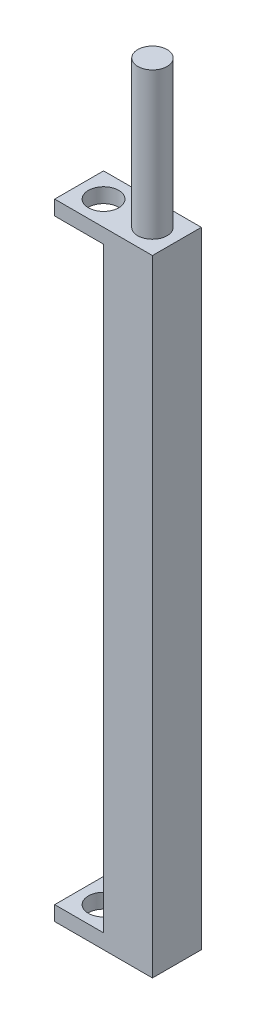
ISO-10303-21;
HEADER;
FILE_DESCRIPTION(('STEP AP214'),'2;1');
FILE_NAME('part.step','',(''),(''),'','','');
FILE_SCHEMA(('AUTOMOTIVE_DESIGN { 1 0 10303 214 1 1 1 1 }'));
ENDSEC;
DATA;
#1=APPLICATION_CONTEXT('core data for automotive mechanical design processes');
#2=APPLICATION_PROTOCOL_DEFINITION('international standard','automotive_design',2000,#1);
#3=PRODUCT_CONTEXT('',#1,'mechanical');
#4=PRODUCT('Part','Part','',(#3));
#5=PRODUCT_RELATED_PRODUCT_CATEGORY('part','',(#4));
#6=PRODUCT_DEFINITION_FORMATION('','',#4);
#7=PRODUCT_DEFINITION_CONTEXT('part definition',#1,'design');
#8=PRODUCT_DEFINITION('design','',#6,#7);
#9=PRODUCT_DEFINITION_SHAPE('','',#8);
#10=(LENGTH_UNIT() NAMED_UNIT(*) SI_UNIT(.MILLI.,.METRE.));
#11=(NAMED_UNIT(*) PLANE_ANGLE_UNIT() SI_UNIT($,.RADIAN.));
#12=(NAMED_UNIT(*) SI_UNIT($,.STERADIAN.) SOLID_ANGLE_UNIT());
#13=UNCERTAINTY_MEASURE_WITH_UNIT(LENGTH_MEASURE(1.E-05),#10,'distance_accuracy_value','');
#14=(GEOMETRIC_REPRESENTATION_CONTEXT(3) GLOBAL_UNCERTAINTY_ASSIGNED_CONTEXT((#13)) GLOBAL_UNIT_ASSIGNED_CONTEXT((#10,
#11,#12)) REPRESENTATION_CONTEXT('',''));
#15=CARTESIAN_POINT('',(0.,0.,0.));
#16=DIRECTION('',(0.,0.,1.));
#17=DIRECTION('',(1.,0.,0.));
#18=AXIS2_PLACEMENT_3D('',#15,#16,#17);
#19=CARTESIAN_POINT('',(0.,0.,0.));
#20=DIRECTION('',(0.,1.,0.));
#21=DIRECTION('',(0.,0.,1.));
#22=AXIS2_PLACEMENT_3D('',#19,#20,#21);
#23=PLANE('',#22);
#24=CARTESIAN_POINT('',(-2.5,0.,0.));
#25=DIRECTION('',(0.,-1.,0.));
#26=DIRECTION('',(0.,0.,-1.));
#27=AXIS2_PLACEMENT_3D('',#24,#25,#26);
#28=CIRCLE('',#27,1.55);
#29=CARTESIAN_POINT('',(-2.5,0.,-1.55));
#30=VERTEX_POINT('',#29);
#31=EDGE_CURVE('E155',#30,#30,#28,.T.);
#32=ORIENTED_EDGE('',*,*,#31,.F.);
#33=EDGE_LOOP('',(#32));
#34=FACE_BOUND('',#33,.T.);
#35=DIRECTION('',(0.,0.,-1.));
#36=VECTOR('',#35,1.);
#37=CARTESIAN_POINT('',(0.,0.,2.5));
#38=LINE('',#37,#36);
#39=CARTESIAN_POINT('',(0.,0.,2.5));
#40=VERTEX_POINT('',#39);
#41=CARTESIAN_POINT('',(0.,0.,-2.5));
#42=VERTEX_POINT('',#41);
#43=EDGE_CURVE('E49',#40,#42,#38,.T.);
#44=ORIENTED_EDGE('',*,*,#43,.F.);
#45=DIRECTION('',(-1.,0.,0.));
#46=VECTOR('',#45,1.);
#47=CARTESIAN_POINT('',(5.,0.,2.5));
#48=LINE('',#47,#46);
#49=CARTESIAN_POINT('',(-5.,0.,2.5));
#50=VERTEX_POINT('',#49);
#51=EDGE_CURVE('E71',#40,#50,#48,.T.);
#52=ORIENTED_EDGE('',*,*,#51,.T.);
#53=DIRECTION('',(0.,0.,-1.));
#54=VECTOR('',#53,1.);
#55=CARTESIAN_POINT('',(-5.,0.,2.5));
#56=LINE('',#55,#54);
#57=CARTESIAN_POINT('',(-5.,0.,-2.5));
#58=VERTEX_POINT('',#57);
#59=EDGE_CURVE('E169',#50,#58,#56,.T.);
#60=ORIENTED_EDGE('',*,*,#59,.T.);
#61=DIRECTION('',(-1.,0.,0.));
#62=VECTOR('',#61,1.);
#63=CARTESIAN_POINT('',(5.,0.,-2.5));
#64=LINE('',#63,#62);
#65=EDGE_CURVE('E159',#42,#58,#64,.T.);
#66=ORIENTED_EDGE('',*,*,#65,.F.);
#67=EDGE_LOOP('',(#44,#52,#60,#66));
#68=FACE_BOUND('',#67,.T.);
#69=ADVANCED_FACE('F34',(#34,#68),#23,.F.);
#70=CARTESIAN_POINT('',(5.,1.5,2.5));
#71=DIRECTION('',(-1.,0.,0.));
#72=DIRECTION('',(0.,0.,1.));
#73=AXIS2_PLACEMENT_3D('',#70,#71,#72);
#74=PLANE('',#73);
#75=DIRECTION('',(0.,-1.,0.));
#76=VECTOR('',#75,1.);
#77=CARTESIAN_POINT('',(5.,1.5,2.5));
#78=LINE('',#77,#76);
#79=CARTESIAN_POINT('',(5.,1.5,2.5));
#80=VERTEX_POINT('',#79);
#81=CARTESIAN_POINT('',(5.,-62.5,2.5));
#82=VERTEX_POINT('',#81);
#83=EDGE_CURVE('E58',#80,#82,#78,.T.);
#84=ORIENTED_EDGE('',*,*,#83,.T.);
#85=DIRECTION('',(0.,0.,1.));
#86=VECTOR('',#85,1.);
#87=CARTESIAN_POINT('',(5.,-62.5,2.5));
#88=LINE('',#87,#86);
#89=CARTESIAN_POINT('',(5.,-62.5,-2.5));
#90=VERTEX_POINT('',#89);
#91=EDGE_CURVE('E107',#90,#82,#88,.T.);
#92=ORIENTED_EDGE('',*,*,#91,.F.);
#93=DIRECTION('',(0.,-1.,0.));
#94=VECTOR('',#93,1.);
#95=CARTESIAN_POINT('',(5.,1.5,-2.5));
#96=LINE('',#95,#94);
#97=CARTESIAN_POINT('',(5.,1.5,-2.5));
#98=VERTEX_POINT('',#97);
#99=EDGE_CURVE('E11',#98,#90,#96,.T.);
#100=ORIENTED_EDGE('',*,*,#99,.F.);
#101=DIRECTION('',(0.,0.,-1.));
#102=VECTOR('',#101,1.);
#103=CARTESIAN_POINT('',(5.,1.5,2.5));
#104=LINE('',#103,#102);
#105=EDGE_CURVE('E108',#80,#98,#104,.T.);
#106=ORIENTED_EDGE('',*,*,#105,.F.);
#107=EDGE_LOOP('',(#84,#92,#100,#106));
#108=FACE_BOUND('',#107,.T.);
#109=ADVANCED_FACE('F36',(#108),#74,.F.);
#110=CARTESIAN_POINT('',(5.,1.5,-2.5));
#111=DIRECTION('',(0.,0.,1.));
#112=DIRECTION('',(1.,0.,0.));
#113=AXIS2_PLACEMENT_3D('',#110,#111,#112);
#114=PLANE('',#113);
#115=ORIENTED_EDGE('',*,*,#99,.T.);
#116=DIRECTION('',(1.,0.,0.));
#117=VECTOR('',#116,1.);
#118=CARTESIAN_POINT('',(5.,-62.5,-2.5));
#119=LINE('',#118,#117);
#120=CARTESIAN_POINT('',(-5.,-62.5,-2.5));
#121=VERTEX_POINT('',#120);
#122=EDGE_CURVE('E125',#121,#90,#119,.T.);
#123=ORIENTED_EDGE('',*,*,#122,.F.);
#124=DIRECTION('',(0.,1.,0.));
#125=VECTOR('',#124,1.);
#126=CARTESIAN_POINT('',(-5.,-62.5,-2.5));
#127=LINE('',#126,#125);
#128=CARTESIAN_POINT('',(-5.,-61.,-2.5));
#129=VERTEX_POINT('',#128);
#130=EDGE_CURVE('E137',#121,#129,#127,.T.);
#131=ORIENTED_EDGE('',*,*,#130,.T.);
#132=DIRECTION('',(1.,0.,0.));
#133=VECTOR('',#132,1.);
#134=CARTESIAN_POINT('',(5.,-61.,-2.5));
#135=LINE('',#134,#133);
#136=CARTESIAN_POINT('',(0.,-61.,-2.5));
#137=VERTEX_POINT('',#136);
#138=EDGE_CURVE('E126',#129,#137,#135,.T.);
#139=ORIENTED_EDGE('',*,*,#138,.T.);
#140=DIRECTION('',(0.,1.,0.));
#141=VECTOR('',#140,1.);
#142=CARTESIAN_POINT('',(0.,-61.,-2.5));
#143=LINE('',#142,#141);
#144=EDGE_CURVE('E148',#137,#42,#143,.T.);
#145=ORIENTED_EDGE('',*,*,#144,.T.);
#146=ORIENTED_EDGE('',*,*,#65,.T.);
#147=DIRECTION('',(0.,-1.,0.));
#148=VECTOR('',#147,1.);
#149=CARTESIAN_POINT('',(-5.,1.5,-2.5));
#150=LINE('',#149,#148);
#151=CARTESIAN_POINT('',(-5.,1.5,-2.5));
#152=VERTEX_POINT('',#151);
#153=EDGE_CURVE('E42',#152,#58,#150,.T.);
#154=ORIENTED_EDGE('',*,*,#153,.F.);
#155=DIRECTION('',(-1.,0.,0.));
#156=VECTOR('',#155,1.);
#157=CARTESIAN_POINT('',(5.,1.5,-2.5));
#158=LINE('',#157,#156);
#159=EDGE_CURVE('E78',#98,#152,#158,.T.);
#160=ORIENTED_EDGE('',*,*,#159,.F.);
#161=EDGE_LOOP('',(#115,#123,#131,#139,#145,#146,#154,#160));
#162=FACE_BOUND('',#161,.T.);
#163=ADVANCED_FACE('F180',(#162),#114,.F.);
#164=CARTESIAN_POINT('',(-5.,1.5,2.5));
#165=DIRECTION('',(-1.,0.,0.));
#166=DIRECTION('',(0.,0.,1.));
#167=AXIS2_PLACEMENT_3D('',#164,#165,#166);
#168=PLANE('',#167);
#169=ORIENTED_EDGE('',*,*,#59,.F.);
#170=DIRECTION('',(0.,-1.,0.));
#171=VECTOR('',#170,1.);
#172=CARTESIAN_POINT('',(-5.,1.5,2.5));
#173=LINE('',#172,#171);
#174=CARTESIAN_POINT('',(-5.,1.5,2.5));
#175=VERTEX_POINT('',#174);
#176=EDGE_CURVE('E110',#175,#50,#173,.T.);
#177=ORIENTED_EDGE('',*,*,#176,.F.);
#178=DIRECTION('',(0.,0.,-1.));
#179=VECTOR('',#178,1.);
#180=CARTESIAN_POINT('',(-5.,1.5,2.5));
#181=LINE('',#180,#179);
#182=EDGE_CURVE('E164',#175,#152,#181,.T.);
#183=ORIENTED_EDGE('',*,*,#182,.T.);
#184=ORIENTED_EDGE('',*,*,#153,.T.);
#185=EDGE_LOOP('',(#169,#177,#183,#184));
#186=FACE_BOUND('',#185,.T.);
#187=ADVANCED_FACE('F175',(#186),#168,.T.);
#188=CARTESIAN_POINT('',(5.,1.5,2.5));
#189=DIRECTION('',(0.,0.,1.));
#190=DIRECTION('',(1.,0.,0.));
#191=AXIS2_PLACEMENT_3D('',#188,#189,#190);
#192=PLANE('',#191);
#193=ORIENTED_EDGE('',*,*,#51,.F.);
#194=DIRECTION('',(0.,1.,0.));
#195=VECTOR('',#194,1.);
#196=CARTESIAN_POINT('',(0.,-61.,2.5));
#197=LINE('',#196,#195);
#198=CARTESIAN_POINT('',(0.,-61.,2.5));
#199=VERTEX_POINT('',#198);
#200=EDGE_CURVE('E152',#199,#40,#197,.T.);
#201=ORIENTED_EDGE('',*,*,#200,.F.);
#202=DIRECTION('',(-1.,0.,0.));
#203=VECTOR('',#202,1.);
#204=CARTESIAN_POINT('',(5.,-61.,2.5));
#205=LINE('',#204,#203);
#206=CARTESIAN_POINT('',(-5.,-61.,2.5));
#207=VERTEX_POINT('',#206);
#208=EDGE_CURVE('E138',#199,#207,#205,.T.);
#209=ORIENTED_EDGE('',*,*,#208,.T.);
#210=DIRECTION('',(0.,1.,0.));
#211=VECTOR('',#210,1.);
#212=CARTESIAN_POINT('',(-5.,-62.5,2.5));
#213=LINE('',#212,#211);
#214=CARTESIAN_POINT('',(-5.,-62.5,2.5));
#215=VERTEX_POINT('',#214);
#216=EDGE_CURVE('E117',#215,#207,#213,.T.);
#217=ORIENTED_EDGE('',*,*,#216,.F.);
#218=DIRECTION('',(-1.,0.,0.));
#219=VECTOR('',#218,1.);
#220=CARTESIAN_POINT('',(5.,-62.5,2.5));
#221=LINE('',#220,#219);
#222=EDGE_CURVE('E114',#82,#215,#221,.T.);
#223=ORIENTED_EDGE('',*,*,#222,.F.);
#224=ORIENTED_EDGE('',*,*,#83,.F.);
#225=DIRECTION('',(-1.,0.,0.));
#226=VECTOR('',#225,1.);
#227=CARTESIAN_POINT('',(5.,1.5,2.5));
#228=LINE('',#227,#226);
#229=EDGE_CURVE('E111',#80,#175,#228,.T.);
#230=ORIENTED_EDGE('',*,*,#229,.T.);
#231=ORIENTED_EDGE('',*,*,#176,.T.);
#232=EDGE_LOOP('',(#193,#201,#209,#217,#223,#224,#230,#231));
#233=FACE_BOUND('',#232,.T.);
#234=ADVANCED_FACE('F115',(#233),#192,.T.);
#235=CARTESIAN_POINT('',(0.,1.5,0.));
#236=DIRECTION('',(0.,1.,0.));
#237=DIRECTION('',(0.,0.,1.));
#238=AXIS2_PLACEMENT_3D('',#235,#236,#237);
#239=PLANE('',#238);
#240=CARTESIAN_POINT('',(2.5,1.5,0.));
#241=DIRECTION('',(0.,1.,0.));
#242=DIRECTION('',(0.,0.,1.));
#243=AXIS2_PLACEMENT_3D('',#240,#241,#242);
#244=CIRCLE('',#243,1.5);
#245=CARTESIAN_POINT('',(2.5,1.5,1.5));
#246=VERTEX_POINT('',#245);
#247=EDGE_CURVE('E324',#246,#246,#244,.T.);
#248=ORIENTED_EDGE('',*,*,#247,.F.);
#249=EDGE_LOOP('',(#248));
#250=FACE_BOUND('',#249,.T.);
#251=CARTESIAN_POINT('',(-2.5,1.5,0.));
#252=DIRECTION('',(0.,-1.,0.));
#253=DIRECTION('',(0.,0.,-1.));
#254=AXIS2_PLACEMENT_3D('',#251,#252,#253);
#255=CIRCLE('',#254,1.55);
#256=CARTESIAN_POINT('',(-2.5,1.5,-1.55));
#257=VERTEX_POINT('',#256);
#258=EDGE_CURVE('E156',#257,#257,#255,.T.);
#259=ORIENTED_EDGE('',*,*,#258,.T.);
#260=EDGE_LOOP('',(#259));
#261=FACE_BOUND('',#260,.T.);
#262=ORIENTED_EDGE('',*,*,#105,.T.);
#263=ORIENTED_EDGE('',*,*,#159,.T.);
#264=ORIENTED_EDGE('',*,*,#182,.F.);
#265=ORIENTED_EDGE('',*,*,#229,.F.);
#266=EDGE_LOOP('',(#262,#263,#264,#265));
#267=FACE_BOUND('',#266,.T.);
#268=ADVANCED_FACE('F188',(#250,#261,#267),#239,.T.);
#269=CARTESIAN_POINT('',(-2.5,1.5,0.));
#270=DIRECTION('',(0.,-1.,0.));
#271=DIRECTION('',(0.,0.,-1.));
#272=AXIS2_PLACEMENT_3D('',#269,#270,#271);
#273=CYLINDRICAL_SURFACE('',#272,1.55);
#274=ORIENTED_EDGE('',*,*,#258,.F.);
#275=EDGE_LOOP('',(#274));
#276=FACE_BOUND('',#275,.T.);
#277=ORIENTED_EDGE('',*,*,#31,.T.);
#278=EDGE_LOOP('',(#277));
#279=FACE_BOUND('',#278,.T.);
#280=ADVANCED_FACE('F190',(#276,#279),#273,.F.);
#281=CARTESIAN_POINT('',(0.,-61.,2.5));
#282=DIRECTION('',(1.,0.,0.));
#283=DIRECTION('',(0.,0.,-1.));
#284=AXIS2_PLACEMENT_3D('',#281,#282,#283);
#285=PLANE('',#284);
#286=ORIENTED_EDGE('',*,*,#43,.T.);
#287=ORIENTED_EDGE('',*,*,#144,.F.);
#288=DIRECTION('',(0.,0.,-1.));
#289=VECTOR('',#288,1.);
#290=CARTESIAN_POINT('',(0.,-61.,2.5));
#291=LINE('',#290,#289);
#292=EDGE_CURVE('E145',#199,#137,#291,.T.);
#293=ORIENTED_EDGE('',*,*,#292,.F.);
#294=ORIENTED_EDGE('',*,*,#200,.T.);
#295=EDGE_LOOP('',(#286,#287,#293,#294));
#296=FACE_BOUND('',#295,.T.);
#297=ADVANCED_FACE('F178',(#296),#285,.F.);
#298=CARTESIAN_POINT('',(-5.,-62.5,2.5));
#299=DIRECTION('',(1.,0.,0.));
#300=DIRECTION('',(0.,0.,-1.));
#301=AXIS2_PLACEMENT_3D('',#298,#299,#300);
#302=PLANE('',#301);
#303=DIRECTION('',(0.,0.,-1.));
#304=VECTOR('',#303,1.);
#305=CARTESIAN_POINT('',(-5.,-61.,2.5));
#306=LINE('',#305,#304);
#307=EDGE_CURVE('E129',#207,#129,#306,.T.);
#308=ORIENTED_EDGE('',*,*,#307,.T.);
#309=ORIENTED_EDGE('',*,*,#130,.F.);
#310=DIRECTION('',(0.,0.,-1.));
#311=VECTOR('',#310,1.);
#312=CARTESIAN_POINT('',(-5.,-62.5,2.5));
#313=LINE('',#312,#311);
#314=EDGE_CURVE('E120',#215,#121,#313,.T.);
#315=ORIENTED_EDGE('',*,*,#314,.F.);
#316=ORIENTED_EDGE('',*,*,#216,.T.);
#317=EDGE_LOOP('',(#308,#309,#315,#316));
#318=FACE_BOUND('',#317,.T.);
#319=ADVANCED_FACE('F236',(#318),#302,.F.);
#320=CARTESIAN_POINT('',(0.,-62.5,0.));
#321=DIRECTION('',(0.,1.,0.));
#322=DIRECTION('',(0.,0.,1.));
#323=AXIS2_PLACEMENT_3D('',#320,#321,#322);
#324=PLANE('',#323);
#325=CARTESIAN_POINT('',(2.5,-62.5,0.));
#326=DIRECTION('',(0.,-1.,0.));
#327=DIRECTION('',(0.,0.,-1.));
#328=AXIS2_PLACEMENT_3D('',#325,#326,#327);
#329=CIRCLE('',#328,1.55);
#330=CARTESIAN_POINT('',(2.5,-62.5,-1.55));
#331=VERTEX_POINT('',#330);
#332=EDGE_CURVE('E325',#331,#331,#329,.T.);
#333=ORIENTED_EDGE('',*,*,#332,.F.);
#334=EDGE_LOOP('',(#333));
#335=FACE_BOUND('',#334,.T.);
#336=CARTESIAN_POINT('',(-2.5,-62.5,0.));
#337=DIRECTION('',(0.,-1.,0.));
#338=DIRECTION('',(0.,0.,-1.));
#339=AXIS2_PLACEMENT_3D('',#336,#337,#338);
#340=CIRCLE('',#339,1.55);
#341=CARTESIAN_POINT('',(-2.5,-62.5,-1.55));
#342=VERTEX_POINT('',#341);
#343=EDGE_CURVE('E132',#342,#342,#340,.T.);
#344=ORIENTED_EDGE('',*,*,#343,.F.);
#345=EDGE_LOOP('',(#344));
#346=FACE_BOUND('',#345,.T.);
#347=ORIENTED_EDGE('',*,*,#91,.T.);
#348=ORIENTED_EDGE('',*,*,#222,.T.);
#349=ORIENTED_EDGE('',*,*,#314,.T.);
#350=ORIENTED_EDGE('',*,*,#122,.T.);
#351=EDGE_LOOP('',(#347,#348,#349,#350));
#352=FACE_BOUND('',#351,.T.);
#353=ADVANCED_FACE('F123',(#335,#346,#352),#324,.F.);
#354=CARTESIAN_POINT('',(0.,-61.,0.));
#355=DIRECTION('',(0.,1.,0.));
#356=DIRECTION('',(0.,0.,1.));
#357=AXIS2_PLACEMENT_3D('',#354,#355,#356);
#358=PLANE('',#357);
#359=CARTESIAN_POINT('',(-2.5,-61.,0.));
#360=DIRECTION('',(0.,-1.,0.));
#361=DIRECTION('',(0.,0.,-1.));
#362=AXIS2_PLACEMENT_3D('',#359,#360,#361);
#363=CIRCLE('',#362,1.55);
#364=CARTESIAN_POINT('',(-2.5,-61.,-1.55));
#365=VERTEX_POINT('',#364);
#366=EDGE_CURVE('E140',#365,#365,#363,.T.);
#367=ORIENTED_EDGE('',*,*,#366,.T.);
#368=EDGE_LOOP('',(#367));
#369=FACE_BOUND('',#368,.T.);
#370=ORIENTED_EDGE('',*,*,#208,.F.);
#371=ORIENTED_EDGE('',*,*,#292,.T.);
#372=ORIENTED_EDGE('',*,*,#138,.F.);
#373=ORIENTED_EDGE('',*,*,#307,.F.);
#374=EDGE_LOOP('',(#370,#371,#372,#373));
#375=FACE_BOUND('',#374,.T.);
#376=ADVANCED_FACE('F186',(#369,#375),#358,.T.);
#377=CARTESIAN_POINT('',(-2.5,-61.,0.));
#378=DIRECTION('',(0.,-1.,0.));
#379=DIRECTION('',(0.,0.,-1.));
#380=AXIS2_PLACEMENT_3D('',#377,#378,#379);
#381=CYLINDRICAL_SURFACE('',#380,1.55);
#382=ORIENTED_EDGE('',*,*,#366,.F.);
#383=EDGE_LOOP('',(#382));
#384=FACE_BOUND('',#383,.T.);
#385=ORIENTED_EDGE('',*,*,#343,.T.);
#386=EDGE_LOOP('',(#385));
#387=FACE_BOUND('',#386,.T.);
#388=ADVANCED_FACE('F256',(#384,#387),#381,.F.);
#389=CARTESIAN_POINT('',(2.5,16.5,0.));
#390=DIRECTION('',(0.,-1.,0.));
#391=DIRECTION('',(0.,0.,-1.));
#392=AXIS2_PLACEMENT_3D('',#389,#390,#391);
#393=CYLINDRICAL_SURFACE('',#392,1.5);
#394=CARTESIAN_POINT('',(2.5,16.5,0.));
#395=DIRECTION('',(0.,1.,0.));
#396=DIRECTION('',(0.,0.,1.));
#397=AXIS2_PLACEMENT_3D('',#394,#395,#396);
#398=CIRCLE('',#397,1.5);
#399=CARTESIAN_POINT('',(2.5,16.5,1.5));
#400=VERTEX_POINT('',#399);
#401=EDGE_CURVE('E328',#400,#400,#398,.T.);
#402=ORIENTED_EDGE('',*,*,#401,.F.);
#403=EDGE_LOOP('',(#402));
#404=FACE_BOUND('',#403,.T.);
#405=ORIENTED_EDGE('',*,*,#247,.T.);
#406=EDGE_LOOP('',(#405));
#407=FACE_BOUND('',#406,.T.);
#408=ADVANCED_FACE('F265',(#404,#407),#393,.T.);
#409=CARTESIAN_POINT('',(2.5,16.5,0.));
#410=DIRECTION('',(0.,1.,0.));
#411=DIRECTION('',(0.,0.,1.));
#412=AXIS2_PLACEMENT_3D('',#409,#410,#411);
#413=PLANE('',#412);
#414=ORIENTED_EDGE('',*,*,#401,.T.);
#415=EDGE_LOOP('',(#414));
#416=FACE_BOUND('',#415,.T.);
#417=ADVANCED_FACE('F282',(#416),#413,.T.);
#418=CARTESIAN_POINT('',(2.5,-52.5,0.));
#419=DIRECTION('',(0.,-1.,0.));
#420=DIRECTION('',(0.,0.,-1.));
#421=AXIS2_PLACEMENT_3D('',#418,#419,#420);
#422=CYLINDRICAL_SURFACE('',#421,1.55);
#423=CARTESIAN_POINT('',(2.5,-52.5,0.));
#424=DIRECTION('',(0.,-1.,0.));
#425=DIRECTION('',(0.,0.,-1.));
#426=AXIS2_PLACEMENT_3D('',#423,#424,#425);
#427=CIRCLE('',#426,1.55);
#428=CARTESIAN_POINT('',(2.5,-52.5,-1.55));
#429=VERTEX_POINT('',#428);
#430=EDGE_CURVE('E323',#429,#429,#427,.T.);
#431=ORIENTED_EDGE('',*,*,#430,.F.);
#432=EDGE_LOOP('',(#431));
#433=FACE_BOUND('',#432,.T.);
#434=ORIENTED_EDGE('',*,*,#332,.T.);
#435=EDGE_LOOP('',(#434));
#436=FACE_BOUND('',#435,.T.);
#437=ADVANCED_FACE('F292',(#433,#436),#422,.F.);
#438=CARTESIAN_POINT('',(2.5,-52.5,0.));
#439=DIRECTION('',(0.,-1.,0.));
#440=DIRECTION('',(0.,0.,-1.));
#441=AXIS2_PLACEMENT_3D('',#438,#439,#440);
#442=PLANE('',#441);
#443=ORIENTED_EDGE('',*,*,#430,.T.);
#444=EDGE_LOOP('',(#443));
#445=FACE_BOUND('',#444,.T.);
#446=ADVANCED_FACE('F307',(#445),#442,.T.);
#447=CLOSED_SHELL('',(#69,#109,#163,#187,#234,#268,#280,#297,#319,#353,#376,#388,#408,#417,#437,#446));
#448=MANIFOLD_SOLID_BREP('B2',#447);
#449=ADVANCED_BREP_SHAPE_REPRESENTATION('',(#18,#448),#14);
#450=SHAPE_DEFINITION_REPRESENTATION(#9,#449);
ENDSEC;
END-ISO-10303-21;
